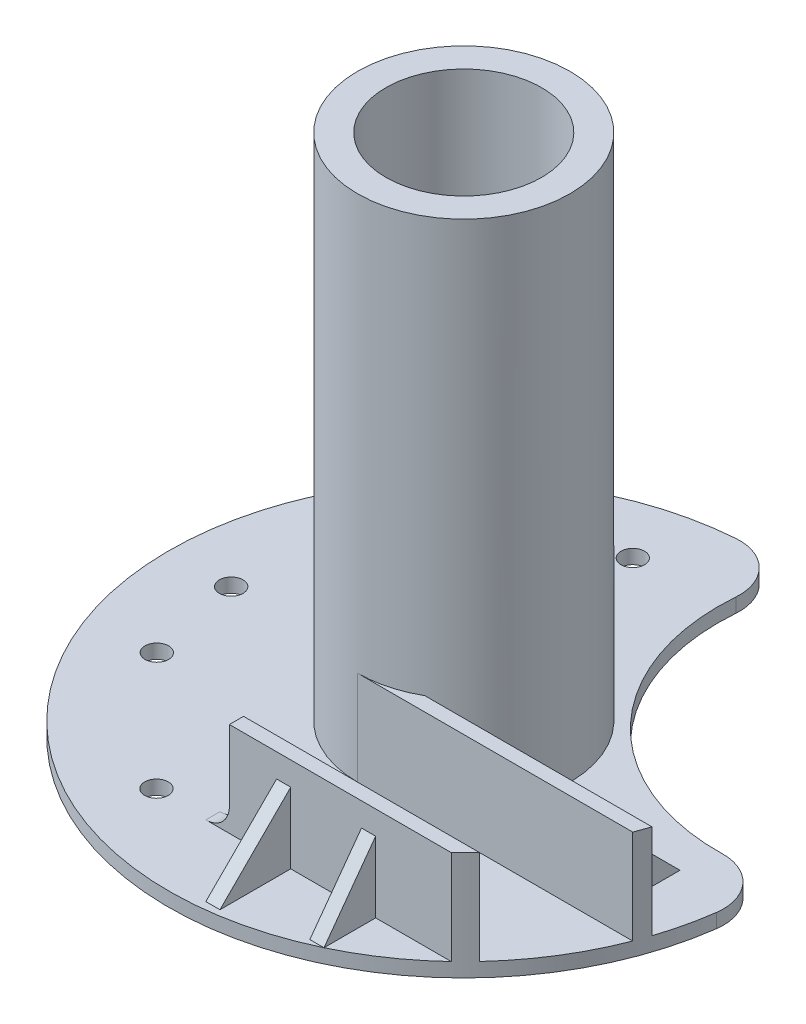
ISO-10303-21;
HEADER;
FILE_DESCRIPTION(('STEP AP214'),'2;1');
FILE_NAME('part.step','',(''),(''),'','','');
FILE_SCHEMA(('AUTOMOTIVE_DESIGN { 1 0 10303 214 1 1 1 1 }'));
ENDSEC;
DATA;
#1=APPLICATION_CONTEXT('core data for automotive mechanical design processes');
#2=APPLICATION_PROTOCOL_DEFINITION('international standard','automotive_design',2000,#1);
#3=PRODUCT_CONTEXT('',#1,'mechanical');
#4=PRODUCT('Part','Part','',(#3));
#5=PRODUCT_RELATED_PRODUCT_CATEGORY('part','',(#4));
#6=PRODUCT_DEFINITION_FORMATION('','',#4);
#7=PRODUCT_DEFINITION_CONTEXT('part definition',#1,'design');
#8=PRODUCT_DEFINITION('design','',#6,#7);
#9=PRODUCT_DEFINITION_SHAPE('','',#8);
#10=(LENGTH_UNIT() NAMED_UNIT(*) SI_UNIT(.MILLI.,.METRE.));
#11=(NAMED_UNIT(*) PLANE_ANGLE_UNIT() SI_UNIT($,.RADIAN.));
#12=(NAMED_UNIT(*) SI_UNIT($,.STERADIAN.) SOLID_ANGLE_UNIT());
#13=UNCERTAINTY_MEASURE_WITH_UNIT(LENGTH_MEASURE(1.E-05),#10,'distance_accuracy_value','');
#14=(GEOMETRIC_REPRESENTATION_CONTEXT(3) GLOBAL_UNCERTAINTY_ASSIGNED_CONTEXT((#13)) GLOBAL_UNIT_ASSIGNED_CONTEXT((#10,
#11,#12)) REPRESENTATION_CONTEXT('',''));
#15=CARTESIAN_POINT('',(0.,0.,0.));
#16=DIRECTION('',(0.,0.,1.));
#17=DIRECTION('',(1.,0.,0.));
#18=AXIS2_PLACEMENT_3D('',#15,#16,#17);
#19=CARTESIAN_POINT('',(0.,-3.,0.));
#20=DIRECTION('',(0.,1.,0.));
#21=DIRECTION('',(0.,0.,1.));
#22=AXIS2_PLACEMENT_3D('',#19,#20,#21);
#23=CYLINDRICAL_SURFACE('',#22,62.5);
#24=CARTESIAN_POINT('',(0.,0.,0.));
#25=DIRECTION('',(0.,1.,0.));
#26=DIRECTION('',(0.,0.,1.));
#27=AXIS2_PLACEMENT_3D('',#24,#25,#26);
#28=CIRCLE('',#27,62.5);
#29=CARTESIAN_POINT('',(-4.61222715479103,0.,-62.3295865594551));
#30=VERTEX_POINT('',#29);
#31=CARTESIAN_POINT('',(26.8257569495584,0.,56.4502326309043));
#32=VERTEX_POINT('',#31);
#33=EDGE_CURVE('E209',#30,#32,#28,.T.);
#34=ORIENTED_EDGE('',*,*,#33,.F.);
#35=DIRECTION('',(0.,1.,0.));
#36=VECTOR('',#35,1.);
#37=CARTESIAN_POINT('',(-4.61222715479103,-3.,-62.3295865594551));
#38=LINE('',#37,#36);
#39=CARTESIAN_POINT('',(-4.61222715479103,-3.,-62.3295865594551));
#40=VERTEX_POINT('',#39);
#41=EDGE_CURVE('E66',#30,#40,#38,.F.);
#42=ORIENTED_EDGE('',*,*,#41,.T.);
#43=CARTESIAN_POINT('',(0.,-3.,0.));
#44=DIRECTION('',(0.,1.,0.));
#45=DIRECTION('',(0.,0.,1.));
#46=AXIS2_PLACEMENT_3D('',#43,#44,#45);
#47=CIRCLE('',#46,62.5);
#48=CARTESIAN_POINT('',(61.9433461512837,-3.,8.32297228051667));
#49=VERTEX_POINT('',#48);
#50=EDGE_CURVE('E377',#40,#49,#47,.T.);
#51=ORIENTED_EDGE('',*,*,#50,.T.);
#52=DIRECTION('',(0.,1.,0.));
#53=VECTOR('',#52,1.);
#54=CARTESIAN_POINT('',(61.9433461512837,-3.,8.32297228051667));
#55=LINE('',#54,#53);
#56=CARTESIAN_POINT('',(61.9433461512837,0.,8.32297228051667));
#57=VERTEX_POINT('',#56);
#58=EDGE_CURVE('E486',#49,#57,#55,.T.);
#59=ORIENTED_EDGE('',*,*,#58,.T.);
#60=CARTESIAN_POINT('',(59.3801313572141,0.,19.5));
#61=VERTEX_POINT('',#60);
#62=EDGE_CURVE('E218',#61,#57,#28,.T.);
#63=ORIENTED_EDGE('',*,*,#62,.F.);
#64=DIRECTION('',(0.,-1.,0.));
#65=VECTOR('',#64,1.);
#66=CARTESIAN_POINT('',(59.3801313572141,20.,19.5));
#67=LINE('',#66,#65);
#68=CARTESIAN_POINT('',(59.3801313572141,20.,19.5));
#69=VERTEX_POINT('',#68);
#70=EDGE_CURVE('E358',#69,#61,#67,.T.);
#71=ORIENTED_EDGE('',*,*,#70,.F.);
#72=CARTESIAN_POINT('',(0.,20.,0.));
#73=DIRECTION('',(0.,1.,0.));
#74=DIRECTION('',(0.,0.,1.));
#75=AXIS2_PLACEMENT_3D('',#72,#73,#74);
#76=CIRCLE('',#75,62.5);
#77=CARTESIAN_POINT('',(58.309518948453,20.,22.5));
#78=VERTEX_POINT('',#77);
#79=EDGE_CURVE('E346',#78,#69,#76,.T.);
#80=ORIENTED_EDGE('',*,*,#79,.F.);
#81=DIRECTION('',(0.,-1.,0.));
#82=VECTOR('',#81,1.);
#83=CARTESIAN_POINT('',(58.309518948453,20.,22.5));
#84=LINE('',#83,#82);
#85=CARTESIAN_POINT('',(58.309518948453,0.,22.5));
#86=VERTEX_POINT('',#85);
#87=EDGE_CURVE('E361',#78,#86,#84,.T.);
#88=ORIENTED_EDGE('',*,*,#87,.T.);
#89=CARTESIAN_POINT('',(45.8257569495584,0.,42.5));
#90=VERTEX_POINT('',#89);
#91=EDGE_CURVE('E219',#90,#86,#28,.T.);
#92=ORIENTED_EDGE('',*,*,#91,.F.);
#93=DIRECTION('',(0.,-1.,0.));
#94=VECTOR('',#93,1.);
#95=CARTESIAN_POINT('',(45.8257569495584,20.,42.5));
#96=LINE('',#95,#94);
#97=CARTESIAN_POINT('',(45.8257569495584,20.,42.5));
#98=VERTEX_POINT('',#97);
#99=EDGE_CURVE('E314',#98,#90,#96,.T.);
#100=ORIENTED_EDGE('',*,*,#99,.F.);
#101=CARTESIAN_POINT('',(0.,20.,0.));
#102=DIRECTION('',(0.,1.,0.));
#103=DIRECTION('',(0.,0.,1.));
#104=AXIS2_PLACEMENT_3D('',#101,#102,#103);
#105=CIRCLE('',#104,62.5);
#106=CARTESIAN_POINT('',(42.8485705712571,20.,45.5));
#107=VERTEX_POINT('',#106);
#108=EDGE_CURVE('E330',#107,#98,#105,.T.);
#109=ORIENTED_EDGE('',*,*,#108,.F.);
#110=DIRECTION('',(0.,-1.,0.));
#111=VECTOR('',#110,1.);
#112=CARTESIAN_POINT('',(42.8485705712571,20.,45.5));
#113=LINE('',#112,#111);
#114=CARTESIAN_POINT('',(42.8485705712571,0.,45.5));
#115=VERTEX_POINT('',#114);
#116=EDGE_CURVE('E253',#107,#115,#113,.T.);
#117=ORIENTED_EDGE('',*,*,#116,.T.);
#118=CARTESIAN_POINT('',(0.,0.,0.));
#119=DIRECTION('',(0.,1.,0.));
#120=DIRECTION('',(0.,0.,1.));
#121=AXIS2_PLACEMENT_3D('',#118,#119,#120);
#122=CIRCLE('',#121,62.5);
#123=EDGE_CURVE('E246',#32,#115,#122,.T.);
#124=ORIENTED_EDGE('',*,*,#123,.F.);
#125=EDGE_LOOP('',(#34,#42,#51,#59,#63,#71,#80,#88,#92,#100,#109,#117,#124));
#126=FACE_BOUND('',#125,.T.);
#127=ADVANCED_FACE('F44',(#126),#23,.T.);
#128=CARTESIAN_POINT('',(-4.17424305044159,20.,42.5));
#129=DIRECTION('',(1.,0.,0.));
#130=DIRECTION('',(0.,0.,-1.));
#131=AXIS2_PLACEMENT_3D('',#128,#129,#130);
#132=PLANE('',#131);
#133=DIRECTION('',(0.,-1.,0.));
#134=VECTOR('',#133,1.);
#135=CARTESIAN_POINT('',(-4.17424305044159,20.,42.5));
#136=LINE('',#135,#134);
#137=CARTESIAN_POINT('',(-4.17424305044159,20.,42.5));
#138=VERTEX_POINT('',#137);
#139=CARTESIAN_POINT('',(-4.17424305044159,5.,42.5));
#140=VERTEX_POINT('',#139);
#141=EDGE_CURVE('E318',#138,#140,#136,.T.);
#142=ORIENTED_EDGE('',*,*,#141,.T.);
#143=DIRECTION('',(0.,0.,1.));
#144=VECTOR('',#143,1.);
#145=CARTESIAN_POINT('',(-4.17424305044159,5.,42.5));
#146=LINE('',#145,#144);
#147=CARTESIAN_POINT('',(-4.17424305044159,5.,45.5));
#148=VERTEX_POINT('',#147);
#149=EDGE_CURVE('E430',#140,#148,#146,.T.);
#150=ORIENTED_EDGE('',*,*,#149,.T.);
#151=DIRECTION('',(0.,-1.,0.));
#152=VECTOR('',#151,1.);
#153=CARTESIAN_POINT('',(-4.17424305044159,20.,45.5));
#154=LINE('',#153,#152);
#155=CARTESIAN_POINT('',(-4.17424305044159,20.,45.5));
#156=VERTEX_POINT('',#155);
#157=EDGE_CURVE('E308',#156,#148,#154,.T.);
#158=ORIENTED_EDGE('',*,*,#157,.F.);
#159=DIRECTION('',(0.,0.,1.));
#160=VECTOR('',#159,1.);
#161=CARTESIAN_POINT('',(-4.17424305044159,20.,42.5));
#162=LINE('',#161,#160);
#163=EDGE_CURVE('E327',#138,#156,#162,.T.);
#164=ORIENTED_EDGE('',*,*,#163,.F.);
#165=EDGE_LOOP('',(#142,#150,#158,#164));
#166=FACE_BOUND('',#165,.T.);
#167=ADVANCED_FACE('F577',(#166),#132,.F.);
#168=CARTESIAN_POINT('',(59.3801313572141,15.0000000000001,19.5));
#169=DIRECTION('',(0.,-0.707106781186544,0.707106781186551));
#170=DIRECTION('',(-1.,0.,0.));
#171=AXIS2_PLACEMENT_3D('',#168,#169,#170);
#172=PLANE('',#171);
#173=DIRECTION('',(0.,0.707106781186551,0.707106781186544));
#174=VECTOR('',#173,1.);
#175=CARTESIAN_POINT('',(50.3377895020348,15.0000000000001,19.5));
#176=LINE('',#175,#174);
#177=CARTESIAN_POINT('',(50.3377895020348,0.,4.50000000000002));
#178=VERTEX_POINT('',#177);
#179=CARTESIAN_POINT('',(50.3377895020348,15.0000000000001,19.5));
#180=VERTEX_POINT('',#179);
#181=EDGE_CURVE('E425',#178,#180,#176,.T.);
#182=ORIENTED_EDGE('',*,*,#181,.F.);
#183=DIRECTION('',(1.,0.,0.));
#184=VECTOR('',#183,1.);
#185=CARTESIAN_POINT('',(0.,0.,4.50000000000003));
#186=LINE('',#185,#184);
#187=CARTESIAN_POINT('',(47.3377895020348,0.,4.50000000000003));
#188=VERTEX_POINT('',#187);
#189=EDGE_CURVE('E398',#188,#178,#186,.T.);
#190=ORIENTED_EDGE('',*,*,#189,.F.);
#191=DIRECTION('',(0.,-0.707106781186551,-0.707106781186544));
#192=VECTOR('',#191,1.);
#193=CARTESIAN_POINT('',(47.3377895020348,15.0000000000001,19.5));
#194=LINE('',#193,#192);
#195=CARTESIAN_POINT('',(47.3377895020348,15.0000000000001,19.5));
#196=VERTEX_POINT('',#195);
#197=EDGE_CURVE('E418',#196,#188,#194,.T.);
#198=ORIENTED_EDGE('',*,*,#197,.F.);
#199=DIRECTION('',(-1.,0.,0.));
#200=VECTOR('',#199,1.);
#201=CARTESIAN_POINT('',(59.3801313572141,15.0000000000001,19.5));
#202=LINE('',#201,#200);
#203=EDGE_CURVE('E393',#180,#196,#202,.T.);
#204=ORIENTED_EDGE('',*,*,#203,.F.);
#205=EDGE_LOOP('',(#182,#190,#198,#204));
#206=FACE_BOUND('',#205,.T.);
#207=ADVANCED_FACE('F595',(#206),#172,.F.);
#208=DIRECTION('',(0.,0.707106781186551,0.707106781186544));
#209=VECTOR('',#208,1.);
#210=CARTESIAN_POINT('',(32.3377895020348,15.0000000000001,19.5));
#211=LINE('',#210,#209);
#212=CARTESIAN_POINT('',(32.3377895020348,0.,4.50000000000002));
#213=VERTEX_POINT('',#212);
#214=CARTESIAN_POINT('',(32.3377895020348,15.0000000000001,19.5));
#215=VERTEX_POINT('',#214);
#216=EDGE_CURVE('E422',#213,#215,#211,.T.);
#217=ORIENTED_EDGE('',*,*,#216,.F.);
#218=CARTESIAN_POINT('',(29.3377895020348,0.,4.50000000000003));
#219=VERTEX_POINT('',#218);
#220=EDGE_CURVE('E402',#219,#213,#186,.T.);
#221=ORIENTED_EDGE('',*,*,#220,.F.);
#222=DIRECTION('',(0.,-0.707106781186551,-0.707106781186544));
#223=VECTOR('',#222,1.);
#224=CARTESIAN_POINT('',(29.3377895020348,15.0000000000001,19.5));
#225=LINE('',#224,#223);
#226=CARTESIAN_POINT('',(29.3377895020348,15.0000000000001,19.5));
#227=VERTEX_POINT('',#226);
#228=EDGE_CURVE('E414',#227,#219,#225,.T.);
#229=ORIENTED_EDGE('',*,*,#228,.F.);
#230=EDGE_CURVE('E387',#215,#227,#202,.T.);
#231=ORIENTED_EDGE('',*,*,#230,.F.);
#232=EDGE_LOOP('',(#217,#221,#229,#231));
#233=FACE_BOUND('',#232,.T.);
#234=ADVANCED_FACE('F529',(#233),#172,.F.);
#235=CARTESIAN_POINT('',(-4.17424305044159,15.0000000000003,45.5));
#236=DIRECTION('',(0.,-0.707106781186544,-0.707106781186551));
#237=DIRECTION('',(1.,0.,0.));
#238=AXIS2_PLACEMENT_3D('',#235,#236,#237);
#239=PLANE('',#238);
#240=DIRECTION('',(0.,-0.707106781186551,0.707106781186544));
#241=VECTOR('',#240,1.);
#242=CARTESIAN_POINT('',(8.82575694955841,15.0000000000003,45.5));
#243=LINE('',#242,#241);
#244=CARTESIAN_POINT('',(8.82575694955841,15.0000000000003,45.5));
#245=VERTEX_POINT('',#244);
#246=CARTESIAN_POINT('',(8.82575694955841,0.,60.5000000000001));
#247=VERTEX_POINT('',#246);
#248=EDGE_CURVE('E410',#245,#247,#243,.T.);
#249=ORIENTED_EDGE('',*,*,#248,.F.);
#250=DIRECTION('',(1.,0.,0.));
#251=VECTOR('',#250,1.);
#252=CARTESIAN_POINT('',(-4.17424305044159,15.0000000000003,45.5));
#253=LINE('',#252,#251);
#254=CARTESIAN_POINT('',(5.82575694955841,15.0000000000003,45.5));
#255=VERTEX_POINT('',#254);
#256=EDGE_CURVE('E406',#255,#245,#253,.T.);
#257=ORIENTED_EDGE('',*,*,#256,.F.);
#258=DIRECTION('',(0.,0.707106781186551,-0.707106781186544));
#259=VECTOR('',#258,1.);
#260=CARTESIAN_POINT('',(5.82575694955841,15.0000000000003,45.5));
#261=LINE('',#260,#259);
#262=CARTESIAN_POINT('',(5.82575694955842,0.,60.5000000000001));
#263=VERTEX_POINT('',#262);
#264=EDGE_CURVE('E407',#263,#255,#261,.T.);
#265=ORIENTED_EDGE('',*,*,#264,.F.);
#266=DIRECTION('',(-1.,0.,0.));
#267=VECTOR('',#266,1.);
#268=CARTESIAN_POINT('',(0.,0.,60.5000000000001));
#269=LINE('',#268,#267);
#270=EDGE_CURVE('E394',#247,#263,#269,.T.);
#271=ORIENTED_EDGE('',*,*,#270,.F.);
#272=EDGE_LOOP('',(#249,#257,#265,#271));
#273=FACE_BOUND('',#272,.T.);
#274=ADVANCED_FACE('F561',(#273),#239,.F.);
#275=CARTESIAN_POINT('',(0.,0.,0.));
#276=DIRECTION('',(0.,1.,0.));
#277=DIRECTION('',(0.,0.,1.));
#278=AXIS2_PLACEMENT_3D('',#275,#276,#277);
#279=PLANE('',#278);
#280=CARTESIAN_POINT('',(-20.1288796613943,0.,45.));
#281=DIRECTION('',(0.,1.,0.));
#282=DIRECTION('',(0.,0.,1.));
#283=AXIS2_PLACEMENT_3D('',#280,#281,#282);
#284=CIRCLE('',#283,2.5);
#285=CARTESIAN_POINT('',(-20.1288796613943,0.,47.5));
#286=VERTEX_POINT('',#285);
#287=EDGE_CURVE('E659',#286,#286,#284,.T.);
#288=ORIENTED_EDGE('',*,*,#287,.F.);
#289=EDGE_LOOP('',(#288));
#290=FACE_BOUND('',#289,.T.);
#291=CARTESIAN_POINT('',(-11.9936822992594,0.,-47.8155140234561));
#292=DIRECTION('',(0.,1.,0.));
#293=DIRECTION('',(0.,0.,1.));
#294=AXIS2_PLACEMENT_3D('',#291,#292,#293);
#295=CIRCLE('',#294,2.5);
#296=CARTESIAN_POINT('',(-11.9936822992594,0.,-45.3155140234561));
#297=VERTEX_POINT('',#296);
#298=EDGE_CURVE('E663',#297,#297,#295,.T.);
#299=ORIENTED_EDGE('',*,*,#298,.F.);
#300=EDGE_LOOP('',(#299));
#301=FACE_BOUND('',#300,.T.);
#302=CARTESIAN_POINT('',(-34.7155843451164,0.,-35.));
#303=DIRECTION('',(0.,1.,0.));
#304=DIRECTION('',(0.,0.,1.));
#305=AXIS2_PLACEMENT_3D('',#302,#303,#304);
#306=CIRCLE('',#305,2.5);
#307=CARTESIAN_POINT('',(-34.7155843451164,0.,-32.5));
#308=VERTEX_POINT('',#307);
#309=EDGE_CURVE('E667',#308,#308,#306,.T.);
#310=ORIENTED_EDGE('',*,*,#309,.F.);
#311=EDGE_LOOP('',(#310));
#312=FACE_BOUND('',#311,.T.);
#313=CARTESIAN_POINT('',(-45.0574277608353,0.,-20.));
#314=DIRECTION('',(0.,1.,0.));
#315=DIRECTION('',(0.,0.,1.));
#316=AXIS2_PLACEMENT_3D('',#313,#314,#315);
#317=CIRCLE('',#316,2.5);
#318=CARTESIAN_POINT('',(-45.0574277608353,0.,-17.5));
#319=VERTEX_POINT('',#318);
#320=EDGE_CURVE('E671',#319,#319,#317,.T.);
#321=ORIENTED_EDGE('',*,*,#320,.F.);
#322=EDGE_LOOP('',(#321));
#323=FACE_BOUND('',#322,.T.);
#324=CARTESIAN_POINT('',(-49.2967726775586,0.,0.));
#325=DIRECTION('',(0.,1.,0.));
#326=DIRECTION('',(0.,0.,1.));
#327=AXIS2_PLACEMENT_3D('',#324,#325,#326);
#328=CIRCLE('',#327,2.5);
#329=CARTESIAN_POINT('',(-49.2967726775586,0.,2.5));
#330=VERTEX_POINT('',#329);
#331=EDGE_CURVE('E658',#330,#330,#328,.T.);
#332=ORIENTED_EDGE('',*,*,#331,.F.);
#333=EDGE_LOOP('',(#332));
#334=FACE_BOUND('',#333,.T.);
#335=CARTESIAN_POINT('',(-45.0574277608353,0.,20.));
#336=DIRECTION('',(0.,1.,0.));
#337=DIRECTION('',(0.,0.,1.));
#338=AXIS2_PLACEMENT_3D('',#335,#336,#337);
#339=CIRCLE('',#338,2.5);
#340=CARTESIAN_POINT('',(-45.0574277608353,0.,22.5));
#341=VERTEX_POINT('',#340);
#342=EDGE_CURVE('E454',#341,#341,#339,.T.);
#343=ORIENTED_EDGE('',*,*,#342,.F.);
#344=EDGE_LOOP('',(#343));
#345=FACE_BOUND('',#344,.T.);
#346=CARTESIAN_POINT('',(50.952741870891,0.,-47.9981051275813));
#347=DIRECTION('',(0.,1.,0.));
#348=DIRECTION('',(0.,0.,1.));
#349=AXIS2_PLACEMENT_3D('',#346,#347,#348);
#350=CIRCLE('',#349,45.0000000000001);
#351=CARTESIAN_POINT('',(6.09427695014197,0.,-51.564353149513));
#352=VERTEX_POINT('',#351);
#353=CARTESIAN_POINT('',(51.8361073314079,0.,-3.00677634676878));
#354=VERTEX_POINT('',#353);
#355=EDGE_CURVE('E240',#352,#354,#350,.T.);
#356=ORIENTED_EDGE('',*,*,#355,.F.);
#357=CARTESIAN_POINT('',(-3.87427081002446,0.,-52.3568527099423));
#358=DIRECTION('',(0.,1.,0.));
#359=DIRECTION('',(0.,0.,1.));
#360=AXIS2_PLACEMENT_3D('',#357,#358,#359);
#361=CIRCLE('',#360,10.);
#362=EDGE_CURVE('E215',#352,#30,#361,.T.);
#363=ORIENTED_EDGE('',*,*,#362,.T.);
#364=ORIENTED_EDGE('',*,*,#33,.T.);
#365=DIRECTION('',(1.,0.,0.));
#366=VECTOR('',#365,1.);
#367=CARTESIAN_POINT('',(16.8257569495584,0.,56.4502326309043));
#368=LINE('',#367,#366);
#369=CARTESIAN_POINT('',(23.8257569495584,0.,56.4502326309043));
#370=VERTEX_POINT('',#369);
#371=EDGE_CURVE('E213',#370,#32,#368,.T.);
#372=ORIENTED_EDGE('',*,*,#371,.F.);
#373=DIRECTION('',(0.,0.,-1.));
#374=VECTOR('',#373,1.);
#375=CARTESIAN_POINT('',(23.8257569495584,0.,45.5));
#376=LINE('',#375,#374);
#377=CARTESIAN_POINT('',(23.8257569495584,0.,45.5));
#378=VERTEX_POINT('',#377);
#379=EDGE_CURVE('E278',#370,#378,#376,.T.);
#380=ORIENTED_EDGE('',*,*,#379,.T.);
#381=DIRECTION('',(-1.,0.,0.));
#382=VECTOR('',#381,1.);
#383=CARTESIAN_POINT('',(8.82575694955841,0.,45.5));
#384=LINE('',#383,#382);
#385=CARTESIAN_POINT('',(8.82575694955841,0.,45.5));
#386=VERTEX_POINT('',#385);
#387=EDGE_CURVE('E274',#378,#386,#384,.T.);
#388=ORIENTED_EDGE('',*,*,#387,.T.);
#389=DIRECTION('',(0.,0.,1.));
#390=VECTOR('',#389,1.);
#391=CARTESIAN_POINT('',(8.82575694955841,0.,45.5));
#392=LINE('',#391,#390);
#393=EDGE_CURVE('E271',#386,#247,#392,.T.);
#394=ORIENTED_EDGE('',*,*,#393,.T.);
#395=ORIENTED_EDGE('',*,*,#270,.T.);
#396=DIRECTION('',(0.,0.,-1.));
#397=VECTOR('',#396,1.);
#398=CARTESIAN_POINT('',(5.82575694955841,0.,45.5));
#399=LINE('',#398,#397);
#400=CARTESIAN_POINT('',(5.82575694955841,0.,45.5));
#401=VERTEX_POINT('',#400);
#402=EDGE_CURVE('E285',#263,#401,#399,.T.);
#403=ORIENTED_EDGE('',*,*,#402,.T.);
#404=DIRECTION('',(-1.,0.,0.));
#405=VECTOR('',#404,1.);
#406=CARTESIAN_POINT('',(-4.17424305044159,0.,45.5));
#407=LINE('',#406,#405);
#408=CARTESIAN_POINT('',(-9.17424305044159,0.,45.5));
#409=VERTEX_POINT('',#408);
#410=EDGE_CURVE('E259',#401,#409,#407,.T.);
#411=ORIENTED_EDGE('',*,*,#410,.T.);
#412=DIRECTION('',(0.,0.,1.));
#413=VECTOR('',#412,1.);
#414=CARTESIAN_POINT('',(-9.17424305044159,0.,0.));
#415=LINE('',#414,#413);
#416=CARTESIAN_POINT('',(-9.17424305044159,0.,42.5));
#417=VERTEX_POINT('',#416);
#418=EDGE_CURVE('E434',#409,#417,#415,.F.);
#419=ORIENTED_EDGE('',*,*,#418,.T.);
#420=DIRECTION('',(-1.,0.,0.));
#421=VECTOR('',#420,1.);
#422=CARTESIAN_POINT('',(-4.17424305044159,0.,42.5));
#423=LINE('',#422,#421);
#424=EDGE_CURVE('E323',#90,#417,#423,.T.);
#425=ORIENTED_EDGE('',*,*,#424,.F.);
#426=ORIENTED_EDGE('',*,*,#91,.T.);
#427=DIRECTION('',(1.,0.,0.));
#428=VECTOR('',#427,1.);
#429=CARTESIAN_POINT('',(0.,0.,22.5));
#430=LINE('',#429,#428);
#431=CARTESIAN_POINT('',(0.,0.,22.5));
#432=VERTEX_POINT('',#431);
#433=EDGE_CURVE('E326',#432,#86,#430,.T.);
#434=ORIENTED_EDGE('',*,*,#433,.F.);
#435=CARTESIAN_POINT('',(0.,0.,0.));
#436=DIRECTION('',(0.,1.,0.));
#437=DIRECTION('',(0.,0.,1.));
#438=AXIS2_PLACEMENT_3D('',#435,#436,#437);
#439=CIRCLE('',#438,22.5);
#440=CARTESIAN_POINT('',(11.2249721603218,0.,19.5));
#441=VERTEX_POINT('',#440);
#442=EDGE_CURVE('E379',#441,#432,#439,.T.);
#443=ORIENTED_EDGE('',*,*,#442,.F.);
#444=DIRECTION('',(1.,0.,0.));
#445=VECTOR('',#444,1.);
#446=CARTESIAN_POINT('',(11.2249721603218,0.,19.5));
#447=LINE('',#446,#445);
#448=CARTESIAN_POINT('',(29.3377895020348,0.,19.5));
#449=VERTEX_POINT('',#448);
#450=EDGE_CURVE('E292',#441,#449,#447,.T.);
#451=ORIENTED_EDGE('',*,*,#450,.T.);
#452=DIRECTION('',(0.,0.,-1.));
#453=VECTOR('',#452,1.);
#454=CARTESIAN_POINT('',(29.3377895020348,0.,4.50000000000002));
#455=LINE('',#454,#453);
#456=EDGE_CURVE('E302',#449,#219,#455,.T.);
#457=ORIENTED_EDGE('',*,*,#456,.T.);
#458=ORIENTED_EDGE('',*,*,#220,.T.);
#459=DIRECTION('',(0.,0.,1.));
#460=VECTOR('',#459,1.);
#461=CARTESIAN_POINT('',(32.3377895020348,0.,4.50000000000002));
#462=LINE('',#461,#460);
#463=CARTESIAN_POINT('',(32.3377895020348,0.,19.5));
#464=VERTEX_POINT('',#463);
#465=EDGE_CURVE('E268',#213,#464,#462,.T.);
#466=ORIENTED_EDGE('',*,*,#465,.T.);
#467=DIRECTION('',(1.,0.,0.));
#468=VECTOR('',#467,1.);
#469=CARTESIAN_POINT('',(32.3377895020348,0.,19.5));
#470=LINE('',#469,#468);
#471=CARTESIAN_POINT('',(47.3377895020348,0.,19.5));
#472=VERTEX_POINT('',#471);
#473=EDGE_CURVE('E533',#464,#472,#470,.T.);
#474=ORIENTED_EDGE('',*,*,#473,.T.);
#475=DIRECTION('',(0.,0.,-1.));
#476=VECTOR('',#475,1.);
#477=CARTESIAN_POINT('',(47.3377895020348,0.,4.50000000000002));
#478=LINE('',#477,#476);
#479=EDGE_CURVE('E540',#472,#188,#478,.T.);
#480=ORIENTED_EDGE('',*,*,#479,.T.);
#481=ORIENTED_EDGE('',*,*,#189,.T.);
#482=DIRECTION('',(0.,0.,1.));
#483=VECTOR('',#482,1.);
#484=CARTESIAN_POINT('',(50.3377895020348,0.,4.50000000000002));
#485=LINE('',#484,#483);
#486=CARTESIAN_POINT('',(50.3377895020348,0.,19.5));
#487=VERTEX_POINT('',#486);
#488=EDGE_CURVE('E289',#178,#487,#485,.T.);
#489=ORIENTED_EDGE('',*,*,#488,.T.);
#490=DIRECTION('',(1.,0.,0.));
#491=VECTOR('',#490,1.);
#492=CARTESIAN_POINT('',(50.3377895020348,0.,19.5));
#493=LINE('',#492,#491);
#494=EDGE_CURVE('E284',#487,#61,#493,.T.);
#495=ORIENTED_EDGE('',*,*,#494,.T.);
#496=ORIENTED_EDGE('',*,*,#62,.T.);
#497=CARTESIAN_POINT('',(52.0324107670783,0.,6.991296715634));
#498=DIRECTION('',(0.,1.,0.));
#499=DIRECTION('',(0.,0.,1.));
#500=AXIS2_PLACEMENT_3D('',#497,#498,#499);
#501=CIRCLE('',#500,10.);
#502=EDGE_CURVE('E481',#57,#354,#501,.T.);
#503=ORIENTED_EDGE('',*,*,#502,.T.);
#504=EDGE_LOOP('',(#356,#363,#364,#372,#380,#388,#394,#395,#403,#411,#419,#425,#426,#434,#443,
#451,#457,#458,#466,#474,#480,#481,#489,#495,#496,#503));
#505=FACE_BOUND('',#504,.T.);
#506=ADVANCED_FACE('F212',(#290,#301,#312,#323,#334,#345,#505),#279,.T.);
#507=CARTESIAN_POINT('',(0.,108.,0.));
#508=DIRECTION('',(0.,-1.,0.));
#509=DIRECTION('',(0.,0.,-1.));
#510=AXIS2_PLACEMENT_3D('',#507,#508,#509);
#511=CYLINDRICAL_SURFACE('',#510,22.5);
#512=CARTESIAN_POINT('',(0.,20.,0.));
#513=DIRECTION('',(0.,-1.,0.));
#514=DIRECTION('',(0.,0.,1.));
#515=AXIS2_PLACEMENT_3D('',#512,#513,#514);
#516=CIRCLE('',#515,22.5);
#517=CARTESIAN_POINT('',(11.2249721603218,20.,19.5));
#518=VERTEX_POINT('',#517);
#519=CARTESIAN_POINT('',(0.,20.,22.5));
#520=VERTEX_POINT('',#519);
#521=EDGE_CURVE('E339',#518,#520,#516,.T.);
#522=ORIENTED_EDGE('',*,*,#521,.F.);
#523=DIRECTION('',(0.,-1.,0.));
#524=VECTOR('',#523,1.);
#525=CARTESIAN_POINT('',(11.2249721603218,20.,19.5));
#526=LINE('',#525,#524);
#527=EDGE_CURVE('E352',#518,#441,#526,.T.);
#528=ORIENTED_EDGE('',*,*,#527,.T.);
#529=ORIENTED_EDGE('',*,*,#442,.T.);
#530=DIRECTION('',(0.,-1.,0.));
#531=VECTOR('',#530,1.);
#532=CARTESIAN_POINT('',(0.,20.,22.5));
#533=LINE('',#532,#531);
#534=EDGE_CURVE('E365',#520,#432,#533,.T.);
#535=ORIENTED_EDGE('',*,*,#534,.F.);
#536=EDGE_LOOP('',(#522,#528,#529,#535));
#537=FACE_BOUND('',#536,.T.);
#538=CARTESIAN_POINT('',(0.,108.,0.));
#539=DIRECTION('',(0.,1.,0.));
#540=DIRECTION('',(0.,0.,1.));
#541=AXIS2_PLACEMENT_3D('',#538,#539,#540);
#542=CIRCLE('',#541,22.5);
#543=CARTESIAN_POINT('',(0.,108.,22.5));
#544=VERTEX_POINT('',#543);
#545=EDGE_CURVE('E383',#544,#544,#542,.T.);
#546=ORIENTED_EDGE('',*,*,#545,.F.);
#547=EDGE_LOOP('',(#546));
#548=FACE_BOUND('',#547,.T.);
#549=ADVANCED_FACE('F515',(#537,#548),#511,.T.);
#550=CARTESIAN_POINT('',(0.,108.,0.));
#551=DIRECTION('',(0.,1.,0.));
#552=DIRECTION('',(0.,0.,1.));
#553=AXIS2_PLACEMENT_3D('',#550,#551,#552);
#554=PLANE('',#553);
#555=CARTESIAN_POINT('',(0.,108.,0.));
#556=DIRECTION('',(0.,1.,0.));
#557=DIRECTION('',(0.,0.,1.));
#558=AXIS2_PLACEMENT_3D('',#555,#556,#557);
#559=CIRCLE('',#558,16.5);
#560=CARTESIAN_POINT('',(0.,108.,16.5));
#561=VERTEX_POINT('',#560);
#562=EDGE_CURVE('E373',#561,#561,#559,.T.);
#563=ORIENTED_EDGE('',*,*,#562,.F.);
#564=EDGE_LOOP('',(#563));
#565=FACE_BOUND('',#564,.T.);
#566=ORIENTED_EDGE('',*,*,#545,.T.);
#567=EDGE_LOOP('',(#566));
#568=FACE_BOUND('',#567,.T.);
#569=ADVANCED_FACE('F600',(#565,#568),#554,.T.);
#570=CARTESIAN_POINT('',(0.,-3.,0.));
#571=DIRECTION('',(0.,1.,0.));
#572=DIRECTION('',(0.,0.,1.));
#573=AXIS2_PLACEMENT_3D('',#570,#571,#572);
#574=PLANE('',#573);
#575=CARTESIAN_POINT('',(-20.1288796613943,-3.,45.));
#576=DIRECTION('',(0.,1.,0.));
#577=DIRECTION('',(0.,0.,1.));
#578=AXIS2_PLACEMENT_3D('',#575,#576,#577);
#579=CIRCLE('',#578,2.5);
#580=CARTESIAN_POINT('',(-20.1288796613943,-3.,47.5));
#581=VERTEX_POINT('',#580);
#582=EDGE_CURVE('E470',#581,#581,#579,.T.);
#583=ORIENTED_EDGE('',*,*,#582,.T.);
#584=EDGE_LOOP('',(#583));
#585=FACE_BOUND('',#584,.T.);
#586=CARTESIAN_POINT('',(-11.9936822992594,-3.,-47.8155140234561));
#587=DIRECTION('',(0.,1.,0.));
#588=DIRECTION('',(0.,0.,1.));
#589=AXIS2_PLACEMENT_3D('',#586,#587,#588);
#590=CIRCLE('',#589,2.5);
#591=CARTESIAN_POINT('',(-11.9936822992594,-3.,-45.3155140234561));
#592=VERTEX_POINT('',#591);
#593=EDGE_CURVE('E466',#592,#592,#590,.T.);
#594=ORIENTED_EDGE('',*,*,#593,.T.);
#595=EDGE_LOOP('',(#594));
#596=FACE_BOUND('',#595,.T.);
#597=CARTESIAN_POINT('',(-34.7155843451164,-3.,-35.));
#598=DIRECTION('',(0.,1.,0.));
#599=DIRECTION('',(0.,0.,1.));
#600=AXIS2_PLACEMENT_3D('',#597,#598,#599);
#601=CIRCLE('',#600,2.5);
#602=CARTESIAN_POINT('',(-34.7155843451164,-3.,-32.5));
#603=VERTEX_POINT('',#602);
#604=EDGE_CURVE('E462',#603,#603,#601,.T.);
#605=ORIENTED_EDGE('',*,*,#604,.T.);
#606=EDGE_LOOP('',(#605));
#607=FACE_BOUND('',#606,.T.);
#608=CARTESIAN_POINT('',(-45.0574277608353,-3.,-20.));
#609=DIRECTION('',(0.,1.,0.));
#610=DIRECTION('',(0.,0.,1.));
#611=AXIS2_PLACEMENT_3D('',#608,#609,#610);
#612=CIRCLE('',#611,2.5);
#613=CARTESIAN_POINT('',(-45.0574277608353,-3.,-17.5));
#614=VERTEX_POINT('',#613);
#615=EDGE_CURVE('E458',#614,#614,#612,.T.);
#616=ORIENTED_EDGE('',*,*,#615,.T.);
#617=EDGE_LOOP('',(#616));
#618=FACE_BOUND('',#617,.T.);
#619=CARTESIAN_POINT('',(-49.2967726775586,-3.,0.));
#620=DIRECTION('',(0.,1.,0.));
#621=DIRECTION('',(0.,0.,1.));
#622=AXIS2_PLACEMENT_3D('',#619,#620,#621);
#623=CIRCLE('',#622,2.5);
#624=CARTESIAN_POINT('',(-49.2967726775586,-3.,2.5));
#625=VERTEX_POINT('',#624);
#626=EDGE_CURVE('E453',#625,#625,#623,.T.);
#627=ORIENTED_EDGE('',*,*,#626,.T.);
#628=EDGE_LOOP('',(#627));
#629=FACE_BOUND('',#628,.T.);
#630=CARTESIAN_POINT('',(-45.0574277608353,-3.,20.));
#631=DIRECTION('',(0.,1.,0.));
#632=DIRECTION('',(0.,0.,1.));
#633=AXIS2_PLACEMENT_3D('',#630,#631,#632);
#634=CIRCLE('',#633,2.5);
#635=CARTESIAN_POINT('',(-45.0574277608353,-3.,22.5));
#636=VERTEX_POINT('',#635);
#637=EDGE_CURVE('E449',#636,#636,#634,.T.);
#638=ORIENTED_EDGE('',*,*,#637,.T.);
#639=EDGE_LOOP('',(#638));
#640=FACE_BOUND('',#639,.T.);
#641=CARTESIAN_POINT('',(0.,-3.,0.));
#642=DIRECTION('',(0.,1.,0.));
#643=DIRECTION('',(0.,0.,1.));
#644=AXIS2_PLACEMENT_3D('',#641,#642,#643);
#645=CIRCLE('',#644,16.5);
#646=CARTESIAN_POINT('',(0.,-3.,16.5));
#647=VERTEX_POINT('',#646);
#648=EDGE_CURVE('E369',#647,#647,#645,.T.);
#649=ORIENTED_EDGE('',*,*,#648,.T.);
#650=EDGE_LOOP('',(#649));
#651=FACE_BOUND('',#650,.T.);
#652=ORIENTED_EDGE('',*,*,#50,.F.);
#653=CARTESIAN_POINT('',(-3.87427081002446,-3.,-52.3568527099423));
#654=DIRECTION('',(0.,1.,0.));
#655=DIRECTION('',(0.,0.,1.));
#656=AXIS2_PLACEMENT_3D('',#653,#654,#655);
#657=CIRCLE('',#656,10.);
#658=CARTESIAN_POINT('',(6.09427695014197,-3.,-51.564353149513));
#659=VERTEX_POINT('',#658);
#660=EDGE_CURVE('E11',#40,#659,#657,.F.);
#661=ORIENTED_EDGE('',*,*,#660,.T.);
#662=CARTESIAN_POINT('',(50.952741870891,-3.,-47.9981051275813));
#663=DIRECTION('',(0.,1.,0.));
#664=DIRECTION('',(0.,0.,1.));
#665=AXIS2_PLACEMENT_3D('',#662,#663,#664);
#666=CIRCLE('',#665,45.0000000000001);
#667=CARTESIAN_POINT('',(51.8361073314079,-3.,-3.00677634676878));
#668=VERTEX_POINT('',#667);
#669=EDGE_CURVE('E445',#659,#668,#666,.T.);
#670=ORIENTED_EDGE('',*,*,#669,.T.);
#671=CARTESIAN_POINT('',(52.0324107670783,-3.,6.991296715634));
#672=DIRECTION('',(0.,1.,0.));
#673=DIRECTION('',(0.,0.,1.));
#674=AXIS2_PLACEMENT_3D('',#671,#672,#673);
#675=CIRCLE('',#674,10.);
#676=EDGE_CURVE('E53',#668,#49,#675,.F.);
#677=ORIENTED_EDGE('',*,*,#676,.T.);
#678=EDGE_LOOP('',(#652,#661,#670,#677));
#679=FACE_BOUND('',#678,.T.);
#680=ADVANCED_FACE('F603',(#585,#596,#607,#618,#629,#640,#651,#679),#574,.F.);
#681=CARTESIAN_POINT('',(0.,108.,0.));
#682=DIRECTION('',(0.,-1.,0.));
#683=DIRECTION('',(0.,0.,-1.));
#684=AXIS2_PLACEMENT_3D('',#681,#682,#683);
#685=CYLINDRICAL_SURFACE('',#684,16.5);
#686=ORIENTED_EDGE('',*,*,#562,.T.);
#687=EDGE_LOOP('',(#686));
#688=FACE_BOUND('',#687,.T.);
#689=ORIENTED_EDGE('',*,*,#648,.F.);
#690=EDGE_LOOP('',(#689));
#691=FACE_BOUND('',#690,.T.);
#692=ADVANCED_FACE('F695',(#688,#691),#685,.F.);
#693=CARTESIAN_POINT('',(0.,20.,22.5));
#694=DIRECTION('',(0.,0.,-1.));
#695=DIRECTION('',(-1.,0.,0.));
#696=AXIS2_PLACEMENT_3D('',#693,#694,#695);
#697=PLANE('',#696);
#698=ORIENTED_EDGE('',*,*,#433,.T.);
#699=ORIENTED_EDGE('',*,*,#87,.F.);
#700=DIRECTION('',(1.,0.,0.));
#701=VECTOR('',#700,1.);
#702=CARTESIAN_POINT('',(0.,20.,22.5));
#703=LINE('',#702,#701);
#704=EDGE_CURVE('E343',#520,#78,#703,.T.);
#705=ORIENTED_EDGE('',*,*,#704,.F.);
#706=ORIENTED_EDGE('',*,*,#534,.T.);
#707=EDGE_LOOP('',(#698,#699,#705,#706));
#708=FACE_BOUND('',#707,.T.);
#709=ADVANCED_FACE('F504',(#708),#697,.F.);
#710=CARTESIAN_POINT('',(59.3801313572141,20.,19.5));
#711=DIRECTION('',(0.,0.,1.));
#712=DIRECTION('',(1.,0.,0.));
#713=AXIS2_PLACEMENT_3D('',#710,#711,#712);
#714=PLANE('',#713);
#715=ORIENTED_EDGE('',*,*,#527,.F.);
#716=DIRECTION('',(-1.,0.,0.));
#717=VECTOR('',#716,1.);
#718=CARTESIAN_POINT('',(59.3801313572141,20.,19.5));
#719=LINE('',#718,#717);
#720=EDGE_CURVE('E349',#69,#518,#719,.T.);
#721=ORIENTED_EDGE('',*,*,#720,.F.);
#722=ORIENTED_EDGE('',*,*,#70,.T.);
#723=ORIENTED_EDGE('',*,*,#494,.F.);
#724=DIRECTION('',(0.,-1.,0.));
#725=VECTOR('',#724,1.);
#726=CARTESIAN_POINT('',(50.3377895020348,108.,19.5));
#727=LINE('',#726,#725);
#728=EDGE_CURVE('E281',#180,#487,#727,.T.);
#729=ORIENTED_EDGE('',*,*,#728,.F.);
#730=ORIENTED_EDGE('',*,*,#203,.T.);
#731=DIRECTION('',(0.,-1.,0.));
#732=VECTOR('',#731,1.);
#733=CARTESIAN_POINT('',(47.3377895020348,108.,19.5));
#734=LINE('',#733,#732);
#735=EDGE_CURVE('E538',#196,#472,#734,.T.);
#736=ORIENTED_EDGE('',*,*,#735,.T.);
#737=ORIENTED_EDGE('',*,*,#473,.F.);
#738=DIRECTION('',(0.,-1.,0.));
#739=VECTOR('',#738,1.);
#740=CARTESIAN_POINT('',(32.3377895020348,108.,19.5));
#741=LINE('',#740,#739);
#742=EDGE_CURVE('E230',#215,#464,#741,.T.);
#743=ORIENTED_EDGE('',*,*,#742,.F.);
#744=ORIENTED_EDGE('',*,*,#230,.T.);
#745=DIRECTION('',(0.,-1.,0.));
#746=VECTOR('',#745,1.);
#747=CARTESIAN_POINT('',(29.3377895020348,108.,19.5));
#748=LINE('',#747,#746);
#749=EDGE_CURVE('E305',#227,#449,#748,.T.);
#750=ORIENTED_EDGE('',*,*,#749,.T.);
#751=ORIENTED_EDGE('',*,*,#450,.F.);
#752=EDGE_LOOP('',(#715,#721,#722,#723,#729,#730,#736,#737,#743,#744,#750,#751));
#753=FACE_BOUND('',#752,.T.);
#754=ADVANCED_FACE('F520',(#753),#714,.F.);
#755=CARTESIAN_POINT('',(0.,20.,0.));
#756=DIRECTION('',(0.,1.,0.));
#757=DIRECTION('',(0.,0.,1.));
#758=AXIS2_PLACEMENT_3D('',#755,#756,#757);
#759=PLANE('',#758);
#760=ORIENTED_EDGE('',*,*,#521,.T.);
#761=ORIENTED_EDGE('',*,*,#704,.T.);
#762=ORIENTED_EDGE('',*,*,#79,.T.);
#763=ORIENTED_EDGE('',*,*,#720,.T.);
#764=EDGE_LOOP('',(#760,#761,#762,#763));
#765=FACE_BOUND('',#764,.T.);
#766=ADVANCED_FACE('F511',(#765),#759,.T.);
#767=CARTESIAN_POINT('',(-4.17424305044159,20.,45.5));
#768=DIRECTION('',(0.,0.,-1.));
#769=DIRECTION('',(-1.,0.,0.));
#770=AXIS2_PLACEMENT_3D('',#767,#768,#769);
#771=PLANE('',#770);
#772=ORIENTED_EDGE('',*,*,#157,.T.);
#773=CARTESIAN_POINT('',(-9.17424305044159,5.,45.5));
#774=DIRECTION('',(0.,0.,-1.));
#775=DIRECTION('',(-1.,0.,0.));
#776=AXIS2_PLACEMENT_3D('',#773,#774,#775);
#777=CIRCLE('',#776,5.);
#778=EDGE_CURVE('E438',#148,#409,#777,.T.);
#779=ORIENTED_EDGE('',*,*,#778,.T.);
#780=ORIENTED_EDGE('',*,*,#410,.F.);
#781=DIRECTION('',(0.,-1.,0.));
#782=VECTOR('',#781,1.);
#783=CARTESIAN_POINT('',(5.82575694955841,108.,45.5));
#784=LINE('',#783,#782);
#785=EDGE_CURVE('E255',#255,#401,#784,.T.);
#786=ORIENTED_EDGE('',*,*,#785,.F.);
#787=ORIENTED_EDGE('',*,*,#256,.T.);
#788=DIRECTION('',(0.,-1.,0.));
#789=VECTOR('',#788,1.);
#790=CARTESIAN_POINT('',(8.82575694955841,108.,45.5));
#791=LINE('',#790,#789);
#792=EDGE_CURVE('E267',#245,#386,#791,.T.);
#793=ORIENTED_EDGE('',*,*,#792,.T.);
#794=ORIENTED_EDGE('',*,*,#387,.F.);
#795=DIRECTION('',(0.,-1.,0.));
#796=VECTOR('',#795,1.);
#797=CARTESIAN_POINT('',(23.8257569495584,108.,45.5));
#798=LINE('',#797,#796);
#799=CARTESIAN_POINT('',(23.8257569495584,15.0000000000003,45.5));
#800=VERTEX_POINT('',#799);
#801=EDGE_CURVE('E263',#800,#378,#798,.T.);
#802=ORIENTED_EDGE('',*,*,#801,.F.);
#803=CARTESIAN_POINT('',(26.8257569495584,15.0000000000003,45.5));
#804=VERTEX_POINT('',#803);
#805=EDGE_CURVE('E403',#800,#804,#253,.T.);
#806=ORIENTED_EDGE('',*,*,#805,.T.);
#807=DIRECTION('',(0.,-1.,0.));
#808=VECTOR('',#807,1.);
#809=CARTESIAN_POINT('',(26.8257569495584,108.,45.5));
#810=LINE('',#809,#808);
#811=CARTESIAN_POINT('',(26.8257569495584,0.,45.5));
#812=VERTEX_POINT('',#811);
#813=EDGE_CURVE('E237',#804,#812,#810,.T.);
#814=ORIENTED_EDGE('',*,*,#813,.T.);
#815=DIRECTION('',(-1.,0.,0.));
#816=VECTOR('',#815,1.);
#817=CARTESIAN_POINT('',(26.8257569495584,0.,45.5));
#818=LINE('',#817,#816);
#819=EDGE_CURVE('E248',#115,#812,#818,.T.);
#820=ORIENTED_EDGE('',*,*,#819,.F.);
#821=ORIENTED_EDGE('',*,*,#116,.F.);
#822=DIRECTION('',(1.,0.,0.));
#823=VECTOR('',#822,1.);
#824=CARTESIAN_POINT('',(-4.17424305044159,20.,45.5));
#825=LINE('',#824,#823);
#826=EDGE_CURVE('E333',#156,#107,#825,.T.);
#827=ORIENTED_EDGE('',*,*,#826,.F.);
#828=EDGE_LOOP('',(#772,#779,#780,#786,#787,#793,#794,#802,#806,#814,#820,#821,#827));
#829=FACE_BOUND('',#828,.T.);
#830=ADVANCED_FACE('F548',(#829),#771,.F.);
#831=CARTESIAN_POINT('',(-4.17424305044159,20.,42.5));
#832=DIRECTION('',(0.,0.,1.));
#833=DIRECTION('',(1.,0.,0.));
#834=AXIS2_PLACEMENT_3D('',#831,#832,#833);
#835=PLANE('',#834);
#836=ORIENTED_EDGE('',*,*,#424,.T.);
#837=CARTESIAN_POINT('',(-9.17424305044159,5.,42.5));
#838=DIRECTION('',(0.,0.,1.));
#839=DIRECTION('',(1.,0.,0.));
#840=AXIS2_PLACEMENT_3D('',#837,#838,#839);
#841=CIRCLE('',#840,5.);
#842=EDGE_CURVE('E442',#417,#140,#841,.T.);
#843=ORIENTED_EDGE('',*,*,#842,.T.);
#844=ORIENTED_EDGE('',*,*,#141,.F.);
#845=DIRECTION('',(-1.,0.,0.));
#846=VECTOR('',#845,1.);
#847=CARTESIAN_POINT('',(-4.17424305044159,20.,42.5));
#848=LINE('',#847,#846);
#849=EDGE_CURVE('E322',#98,#138,#848,.T.);
#850=ORIENTED_EDGE('',*,*,#849,.F.);
#851=ORIENTED_EDGE('',*,*,#99,.T.);
#852=EDGE_LOOP('',(#836,#843,#844,#850,#851));
#853=FACE_BOUND('',#852,.T.);
#854=ADVANCED_FACE('F573',(#853),#835,.F.);
#855=CARTESIAN_POINT('',(0.,20.,0.));
#856=DIRECTION('',(0.,1.,0.));
#857=DIRECTION('',(0.,0.,1.));
#858=AXIS2_PLACEMENT_3D('',#855,#856,#857);
#859=PLANE('',#858);
#860=ORIENTED_EDGE('',*,*,#163,.T.);
#861=ORIENTED_EDGE('',*,*,#826,.T.);
#862=ORIENTED_EDGE('',*,*,#108,.T.);
#863=ORIENTED_EDGE('',*,*,#849,.T.);
#864=EDGE_LOOP('',(#860,#861,#862,#863));
#865=FACE_BOUND('',#864,.T.);
#866=ADVANCED_FACE('F579',(#865),#859,.T.);
#867=CARTESIAN_POINT('',(5.82575694955841,108.,45.5));
#868=DIRECTION('',(-1.,0.,0.));
#869=DIRECTION('',(0.,0.,1.));
#870=AXIS2_PLACEMENT_3D('',#867,#868,#869);
#871=PLANE('',#870);
#872=ORIENTED_EDGE('',*,*,#264,.T.);
#873=ORIENTED_EDGE('',*,*,#785,.T.);
#874=ORIENTED_EDGE('',*,*,#402,.F.);
#875=EDGE_LOOP('',(#872,#873,#874));
#876=FACE_BOUND('',#875,.T.);
#877=ADVANCED_FACE('F581',(#876),#871,.T.);
#878=CARTESIAN_POINT('',(26.8257569495584,108.,45.5));
#879=DIRECTION('',(1.,0.,0.));
#880=DIRECTION('',(0.,0.,-1.));
#881=AXIS2_PLACEMENT_3D('',#878,#879,#880);
#882=PLANE('',#881);
#883=DIRECTION('',(0.,0.807681025593271,-0.589619674787572));
#884=VECTOR('',#883,1.);
#885=CARTESIAN_POINT('',(26.8257569495584,15.0000000000003,45.5));
#886=LINE('',#885,#884);
#887=EDGE_CURVE('E224',#32,#804,#886,.T.);
#888=ORIENTED_EDGE('',*,*,#887,.F.);
#889=DIRECTION('',(0.,0.,1.));
#890=VECTOR('',#889,1.);
#891=CARTESIAN_POINT('',(26.8257569495584,0.,45.5));
#892=LINE('',#891,#890);
#893=EDGE_CURVE('E236',#812,#32,#892,.T.);
#894=ORIENTED_EDGE('',*,*,#893,.F.);
#895=ORIENTED_EDGE('',*,*,#813,.F.);
#896=EDGE_LOOP('',(#888,#894,#895));
#897=FACE_BOUND('',#896,.T.);
#898=ADVANCED_FACE('F235',(#897),#882,.T.);
#899=CARTESIAN_POINT('',(0.,0.,0.));
#900=DIRECTION('',(0.,1.,0.));
#901=DIRECTION('',(0.,0.,1.));
#902=AXIS2_PLACEMENT_3D('',#899,#900,#901);
#903=PLANE('',#902);
#904=ORIENTED_EDGE('',*,*,#123,.T.);
#905=ORIENTED_EDGE('',*,*,#819,.T.);
#906=ORIENTED_EDGE('',*,*,#893,.T.);
#907=EDGE_LOOP('',(#904,#905,#906));
#908=FACE_BOUND('',#907,.T.);
#909=ADVANCED_FACE('F245',(#908),#903,.T.);
#910=CARTESIAN_POINT('',(23.8257569495584,108.,45.5));
#911=DIRECTION('',(-1.,0.,0.));
#912=DIRECTION('',(0.,0.,1.));
#913=AXIS2_PLACEMENT_3D('',#910,#911,#912);
#914=PLANE('',#913);
#915=DIRECTION('',(0.,-0.807681025593271,0.589619674787572));
#916=VECTOR('',#915,1.);
#917=CARTESIAN_POINT('',(23.8257569495584,75.6684234366161,1.21111000125721));
#918=LINE('',#917,#916);
#919=EDGE_CURVE('E227',#800,#370,#918,.T.);
#920=ORIENTED_EDGE('',*,*,#919,.F.);
#921=ORIENTED_EDGE('',*,*,#801,.T.);
#922=ORIENTED_EDGE('',*,*,#379,.F.);
#923=EDGE_LOOP('',(#920,#921,#922));
#924=FACE_BOUND('',#923,.T.);
#925=ADVANCED_FACE('F552',(#924),#914,.T.);
#926=CARTESIAN_POINT('',(8.82575694955841,108.,45.5));
#927=DIRECTION('',(1.,0.,0.));
#928=DIRECTION('',(0.,0.,-1.));
#929=AXIS2_PLACEMENT_3D('',#926,#927,#928);
#930=PLANE('',#929);
#931=ORIENTED_EDGE('',*,*,#248,.T.);
#932=ORIENTED_EDGE('',*,*,#393,.F.);
#933=ORIENTED_EDGE('',*,*,#792,.F.);
#934=EDGE_LOOP('',(#931,#932,#933));
#935=FACE_BOUND('',#934,.T.);
#936=ADVANCED_FACE('F555',(#935),#930,.T.);
#937=CARTESIAN_POINT('',(29.3377895020348,108.,4.50000000000002));
#938=DIRECTION('',(-1.,0.,0.));
#939=DIRECTION('',(0.,0.,1.));
#940=AXIS2_PLACEMENT_3D('',#937,#938,#939);
#941=PLANE('',#940);
#942=ORIENTED_EDGE('',*,*,#228,.T.);
#943=ORIENTED_EDGE('',*,*,#456,.F.);
#944=ORIENTED_EDGE('',*,*,#749,.F.);
#945=EDGE_LOOP('',(#942,#943,#944));
#946=FACE_BOUND('',#945,.T.);
#947=ADVANCED_FACE('F525',(#946),#941,.T.);
#948=CARTESIAN_POINT('',(32.3377895020348,108.,4.50000000000002));
#949=DIRECTION('',(1.,0.,0.));
#950=DIRECTION('',(0.,0.,-1.));
#951=AXIS2_PLACEMENT_3D('',#948,#949,#950);
#952=PLANE('',#951);
#953=ORIENTED_EDGE('',*,*,#216,.T.);
#954=ORIENTED_EDGE('',*,*,#742,.T.);
#955=ORIENTED_EDGE('',*,*,#465,.F.);
#956=EDGE_LOOP('',(#953,#954,#955));
#957=FACE_BOUND('',#956,.T.);
#958=ADVANCED_FACE('F717',(#957),#952,.T.);
#959=CARTESIAN_POINT('',(47.3377895020348,108.,4.50000000000002));
#960=DIRECTION('',(-1.,0.,0.));
#961=DIRECTION('',(0.,0.,1.));
#962=AXIS2_PLACEMENT_3D('',#959,#960,#961);
#963=PLANE('',#962);
#964=ORIENTED_EDGE('',*,*,#197,.T.);
#965=ORIENTED_EDGE('',*,*,#479,.F.);
#966=ORIENTED_EDGE('',*,*,#735,.F.);
#967=EDGE_LOOP('',(#964,#965,#966));
#968=FACE_BOUND('',#967,.T.);
#969=ADVANCED_FACE('F648',(#968),#963,.T.);
#970=CARTESIAN_POINT('',(50.3377895020348,108.,4.50000000000002));
#971=DIRECTION('',(1.,0.,0.));
#972=DIRECTION('',(0.,0.,-1.));
#973=AXIS2_PLACEMENT_3D('',#970,#971,#972);
#974=PLANE('',#973);
#975=ORIENTED_EDGE('',*,*,#181,.T.);
#976=ORIENTED_EDGE('',*,*,#728,.T.);
#977=ORIENTED_EDGE('',*,*,#488,.F.);
#978=EDGE_LOOP('',(#975,#976,#977));
#979=FACE_BOUND('',#978,.T.);
#980=ADVANCED_FACE('F719',(#979),#974,.T.);
#981=CARTESIAN_POINT('',(16.8257569495584,15.0000000000003,45.5));
#982=DIRECTION('',(0.,-0.589619674787572,-0.807681025593271));
#983=DIRECTION('',(0.,0.807681025593271,-0.589619674787572));
#984=AXIS2_PLACEMENT_3D('',#981,#982,#983);
#985=PLANE('',#984);
#986=ORIENTED_EDGE('',*,*,#919,.T.);
#987=ORIENTED_EDGE('',*,*,#371,.T.);
#988=ORIENTED_EDGE('',*,*,#887,.T.);
#989=ORIENTED_EDGE('',*,*,#805,.F.);
#990=EDGE_LOOP('',(#986,#987,#988,#989));
#991=FACE_BOUND('',#990,.T.);
#992=ADVANCED_FACE('F223',(#991),#985,.F.);
#993=CARTESIAN_POINT('',(-9.17424305044159,5.,42.5));
#994=DIRECTION('',(0.,0.,1.));
#995=DIRECTION('',(1.,0.,0.));
#996=AXIS2_PLACEMENT_3D('',#993,#994,#995);
#997=CYLINDRICAL_SURFACE('',#996,5.);
#998=ORIENTED_EDGE('',*,*,#842,.F.);
#999=ORIENTED_EDGE('',*,*,#418,.F.);
#1000=ORIENTED_EDGE('',*,*,#778,.F.);
#1001=ORIENTED_EDGE('',*,*,#149,.F.);
#1002=EDGE_LOOP('',(#998,#999,#1000,#1001));
#1003=FACE_BOUND('',#1002,.T.);
#1004=ADVANCED_FACE('F570',(#1003),#997,.F.);
#1005=CARTESIAN_POINT('',(50.952741870891,-249.,-47.9981051275813));
#1006=DIRECTION('',(0.,1.,0.));
#1007=DIRECTION('',(0.,0.,1.));
#1008=AXIS2_PLACEMENT_3D('',#1005,#1006,#1007);
#1009=CYLINDRICAL_SURFACE('',#1008,45.0000000000001);
#1010=ORIENTED_EDGE('',*,*,#669,.F.);
#1011=DIRECTION('',(0.,1.,0.));
#1012=VECTOR('',#1011,1.);
#1013=CARTESIAN_POINT('',(6.09427695014198,-249.,-51.564353149513));
#1014=LINE('',#1013,#1012);
#1015=EDGE_CURVE('E477',#659,#352,#1014,.T.);
#1016=ORIENTED_EDGE('',*,*,#1015,.T.);
#1017=ORIENTED_EDGE('',*,*,#355,.T.);
#1018=DIRECTION('',(0.,1.,0.));
#1019=VECTOR('',#1018,1.);
#1020=CARTESIAN_POINT('',(51.8361073314079,-249.,-3.00677634676878));
#1021=LINE('',#1020,#1019);
#1022=EDGE_CURVE('E448',#354,#668,#1021,.F.);
#1023=ORIENTED_EDGE('',*,*,#1022,.T.);
#1024=EDGE_LOOP('',(#1010,#1016,#1017,#1023));
#1025=FACE_BOUND('',#1024,.T.);
#1026=ADVANCED_FACE('F619',(#1025),#1009,.F.);
#1027=CARTESIAN_POINT('',(-45.0574277608353,-5.,20.));
#1028=DIRECTION('',(0.,1.,0.));
#1029=DIRECTION('',(0.,0.,1.));
#1030=AXIS2_PLACEMENT_3D('',#1027,#1028,#1029);
#1031=CYLINDRICAL_SURFACE('',#1030,2.5);
#1032=ORIENTED_EDGE('',*,*,#342,.T.);
#1033=EDGE_LOOP('',(#1032));
#1034=FACE_BOUND('',#1033,.T.);
#1035=ORIENTED_EDGE('',*,*,#637,.F.);
#1036=EDGE_LOOP('',(#1035));
#1037=FACE_BOUND('',#1036,.T.);
#1038=ADVANCED_FACE('F687',(#1034,#1037),#1031,.F.);
#1039=CARTESIAN_POINT('',(-49.2967726775586,-5.,0.));
#1040=DIRECTION('',(0.,1.,0.));
#1041=DIRECTION('',(0.,0.,1.));
#1042=AXIS2_PLACEMENT_3D('',#1039,#1040,#1041);
#1043=CYLINDRICAL_SURFACE('',#1042,2.5);
#1044=ORIENTED_EDGE('',*,*,#331,.T.);
#1045=EDGE_LOOP('',(#1044));
#1046=FACE_BOUND('',#1045,.T.);
#1047=ORIENTED_EDGE('',*,*,#626,.F.);
#1048=EDGE_LOOP('',(#1047));
#1049=FACE_BOUND('',#1048,.T.);
#1050=ADVANCED_FACE('F679',(#1046,#1049),#1043,.F.);
#1051=CARTESIAN_POINT('',(-45.0574277608353,-5.,-20.));
#1052=DIRECTION('',(0.,1.,0.));
#1053=DIRECTION('',(0.,0.,1.));
#1054=AXIS2_PLACEMENT_3D('',#1051,#1052,#1053);
#1055=CYLINDRICAL_SURFACE('',#1054,2.5);
#1056=ORIENTED_EDGE('',*,*,#320,.T.);
#1057=EDGE_LOOP('',(#1056));
#1058=FACE_BOUND('',#1057,.T.);
#1059=ORIENTED_EDGE('',*,*,#615,.F.);
#1060=EDGE_LOOP('',(#1059));
#1061=FACE_BOUND('',#1060,.T.);
#1062=ADVANCED_FACE('F744',(#1058,#1061),#1055,.F.);
#1063=CARTESIAN_POINT('',(-34.7155843451164,-5.,-35.));
#1064=DIRECTION('',(0.,1.,0.));
#1065=DIRECTION('',(0.,0.,1.));
#1066=AXIS2_PLACEMENT_3D('',#1063,#1064,#1065);
#1067=CYLINDRICAL_SURFACE('',#1066,2.5);
#1068=ORIENTED_EDGE('',*,*,#309,.T.);
#1069=EDGE_LOOP('',(#1068));
#1070=FACE_BOUND('',#1069,.T.);
#1071=ORIENTED_EDGE('',*,*,#604,.F.);
#1072=EDGE_LOOP('',(#1071));
#1073=FACE_BOUND('',#1072,.T.);
#1074=ADVANCED_FACE('F740',(#1070,#1073),#1067,.F.);
#1075=CARTESIAN_POINT('',(-11.9936822992594,-5.,-47.8155140234561));
#1076=DIRECTION('',(0.,1.,0.));
#1077=DIRECTION('',(0.,0.,1.));
#1078=AXIS2_PLACEMENT_3D('',#1075,#1076,#1077);
#1079=CYLINDRICAL_SURFACE('',#1078,2.5);
#1080=ORIENTED_EDGE('',*,*,#298,.T.);
#1081=EDGE_LOOP('',(#1080));
#1082=FACE_BOUND('',#1081,.T.);
#1083=ORIENTED_EDGE('',*,*,#593,.F.);
#1084=EDGE_LOOP('',(#1083));
#1085=FACE_BOUND('',#1084,.T.);
#1086=ADVANCED_FACE('F629',(#1082,#1085),#1079,.F.);
#1087=CARTESIAN_POINT('',(-20.1288796613943,-5.,45.));
#1088=DIRECTION('',(0.,1.,0.));
#1089=DIRECTION('',(0.,0.,1.));
#1090=AXIS2_PLACEMENT_3D('',#1087,#1088,#1089);
#1091=CYLINDRICAL_SURFACE('',#1090,2.5);
#1092=ORIENTED_EDGE('',*,*,#287,.T.);
#1093=EDGE_LOOP('',(#1092));
#1094=FACE_BOUND('',#1093,.T.);
#1095=ORIENTED_EDGE('',*,*,#582,.F.);
#1096=EDGE_LOOP('',(#1095));
#1097=FACE_BOUND('',#1096,.T.);
#1098=ADVANCED_FACE('F622',(#1094,#1097),#1091,.F.);
#1099=CARTESIAN_POINT('',(-3.87427081002446,-3.,-52.3568527099423));
#1100=DIRECTION('',(0.,-1.,0.));
#1101=DIRECTION('',(0.,0.,-1.));
#1102=AXIS2_PLACEMENT_3D('',#1099,#1100,#1101);
#1103=CYLINDRICAL_SURFACE('',#1102,10.);
#1104=ORIENTED_EDGE('',*,*,#660,.F.);
#1105=ORIENTED_EDGE('',*,*,#41,.F.);
#1106=ORIENTED_EDGE('',*,*,#362,.F.);
#1107=ORIENTED_EDGE('',*,*,#1015,.F.);
#1108=EDGE_LOOP('',(#1104,#1105,#1106,#1107));
#1109=FACE_BOUND('',#1108,.T.);
#1110=ADVANCED_FACE('F620',(#1109),#1103,.T.);
#1111=CARTESIAN_POINT('',(52.0324107670783,-3.,6.991296715634));
#1112=DIRECTION('',(0.,1.,0.));
#1113=DIRECTION('',(0.,0.,1.));
#1114=AXIS2_PLACEMENT_3D('',#1111,#1112,#1113);
#1115=CYLINDRICAL_SURFACE('',#1114,10.);
#1116=ORIENTED_EDGE('',*,*,#502,.F.);
#1117=ORIENTED_EDGE('',*,*,#58,.F.);
#1118=ORIENTED_EDGE('',*,*,#676,.F.);
#1119=ORIENTED_EDGE('',*,*,#1022,.F.);
#1120=EDGE_LOOP('',(#1116,#1117,#1118,#1119));
#1121=FACE_BOUND('',#1120,.T.);
#1122=ADVANCED_FACE('F46',(#1121),#1115,.T.);
#1123=CLOSED_SHELL('',(#127,#167,#207,#234,#274,#506,#549,#569,#680,#692,#709,#754,#766,#830,
#854,#866,#877,#898,#909,#925,#936,#947,#958,#969,#980,#992,#1004,#1026,#1038,#1050,#1062,#1074,
#1086,#1098,#1110,#1122));
#1124=MANIFOLD_SOLID_BREP('B2',#1123);
#1125=ADVANCED_BREP_SHAPE_REPRESENTATION('',(#18,#1124),#14);
#1126=SHAPE_DEFINITION_REPRESENTATION(#9,#1125);
ENDSEC;
END-ISO-10303-21;
